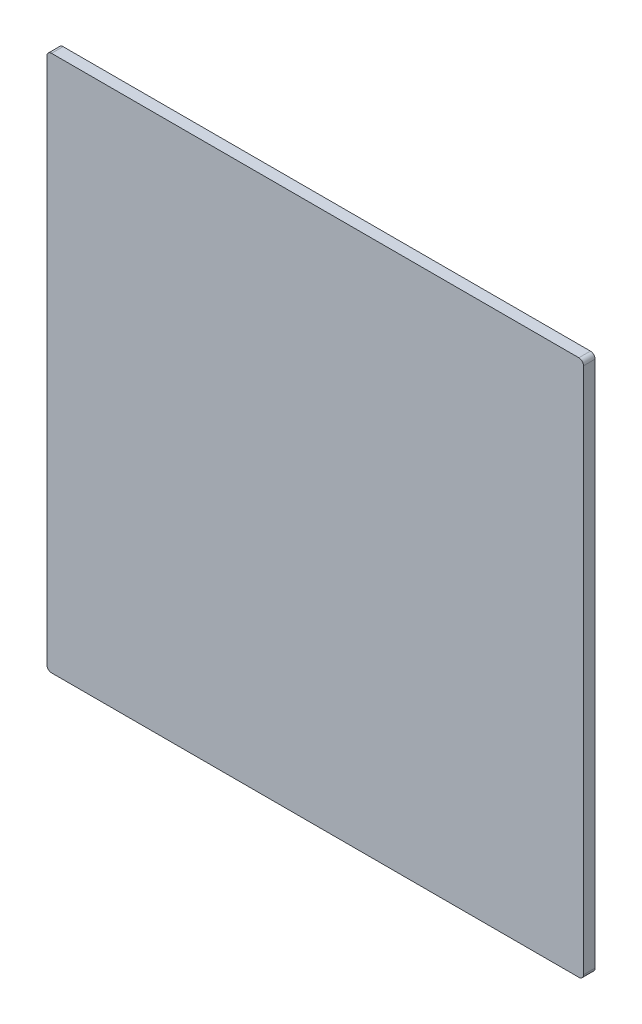
ISO-10303-21;
HEADER;
FILE_DESCRIPTION(('STEP AP214'),'2;1');
FILE_NAME('part.step','',(''),(''),'','','');
FILE_SCHEMA(('AUTOMOTIVE_DESIGN { 1 0 10303 214 1 1 1 1 }'));
ENDSEC;
DATA;
#1=APPLICATION_CONTEXT('core data for automotive mechanical design processes');
#2=APPLICATION_PROTOCOL_DEFINITION('international standard','automotive_design',2000,#1);
#3=PRODUCT_CONTEXT('',#1,'mechanical');
#4=PRODUCT('Part','Part','',(#3));
#5=PRODUCT_RELATED_PRODUCT_CATEGORY('part','',(#4));
#6=PRODUCT_DEFINITION_FORMATION('','',#4);
#7=PRODUCT_DEFINITION_CONTEXT('part definition',#1,'design');
#8=PRODUCT_DEFINITION('design','',#6,#7);
#9=PRODUCT_DEFINITION_SHAPE('','',#8);
#10=(LENGTH_UNIT() NAMED_UNIT(*) SI_UNIT(.MILLI.,.METRE.));
#11=(NAMED_UNIT(*) PLANE_ANGLE_UNIT() SI_UNIT($,.RADIAN.));
#12=(NAMED_UNIT(*) SI_UNIT($,.STERADIAN.) SOLID_ANGLE_UNIT());
#13=UNCERTAINTY_MEASURE_WITH_UNIT(LENGTH_MEASURE(1.E-05),#10,'distance_accuracy_value','');
#14=(GEOMETRIC_REPRESENTATION_CONTEXT(3) GLOBAL_UNCERTAINTY_ASSIGNED_CONTEXT((#13)) GLOBAL_UNIT_ASSIGNED_CONTEXT((#10,
#11,#12)) REPRESENTATION_CONTEXT('',''));
#15=CARTESIAN_POINT('',(0.,0.,0.));
#16=DIRECTION('',(0.,0.,1.));
#17=DIRECTION('',(1.,0.,0.));
#18=AXIS2_PLACEMENT_3D('',#15,#16,#17);
#19=CARTESIAN_POINT('',(0.,0.,6.35));
#20=DIRECTION('',(1.,0.,0.));
#21=DIRECTION('',(0.,1.,0.));
#22=AXIS2_PLACEMENT_3D('',#19,#20,#21);
#23=PLANE('',#22);
#24=DIRECTION('',(0.,-1.,0.));
#25=VECTOR('',#24,1.);
#26=CARTESIAN_POINT('',(0.,0.,0.));
#27=LINE('',#26,#25);
#28=CARTESIAN_POINT('',(0.,292.1,0.));
#29=VERTEX_POINT('',#28);
#30=CARTESIAN_POINT('',(0.,2.54,0.));
#31=VERTEX_POINT('',#30);
#32=EDGE_CURVE('E132',#29,#31,#27,.T.);
#33=ORIENTED_EDGE('',*,*,#32,.T.);
#34=DIRECTION('',(0.,0.,-1.));
#35=VECTOR('',#34,1.);
#36=CARTESIAN_POINT('',(0.,2.54,6.35));
#37=LINE('',#36,#35);
#38=CARTESIAN_POINT('',(0.,2.54,6.35));
#39=VERTEX_POINT('',#38);
#40=EDGE_CURVE('E110',#31,#39,#37,.F.);
#41=ORIENTED_EDGE('',*,*,#40,.T.);
#42=DIRECTION('',(0.,-1.,0.));
#43=VECTOR('',#42,1.);
#44=CARTESIAN_POINT('',(0.,0.,6.35));
#45=LINE('',#44,#43);
#46=CARTESIAN_POINT('',(0.,292.1,6.35));
#47=VERTEX_POINT('',#46);
#48=EDGE_CURVE('E140',#47,#39,#45,.T.);
#49=ORIENTED_EDGE('',*,*,#48,.F.);
#50=DIRECTION('',(0.,0.,-1.));
#51=VECTOR('',#50,1.);
#52=CARTESIAN_POINT('',(0.,292.1,6.35));
#53=LINE('',#52,#51);
#54=EDGE_CURVE('E115',#47,#29,#53,.T.);
#55=ORIENTED_EDGE('',*,*,#54,.T.);
#56=EDGE_LOOP('',(#33,#41,#49,#55));
#57=FACE_BOUND('',#56,.T.);
#58=ADVANCED_FACE('F39',(#57),#23,.F.);
#59=CARTESIAN_POINT('',(0.,0.,6.35));
#60=DIRECTION('',(0.,1.,0.));
#61=DIRECTION('',(0.,0.,1.));
#62=AXIS2_PLACEMENT_3D('',#59,#60,#61);
#63=PLANE('',#62);
#64=DIRECTION('',(1.,0.,0.));
#65=VECTOR('',#64,1.);
#66=CARTESIAN_POINT('',(0.,0.,6.35));
#67=LINE('',#66,#65);
#68=CARTESIAN_POINT('',(2.54,0.,6.35));
#69=VERTEX_POINT('',#68);
#70=CARTESIAN_POINT('',(292.1,0.,6.35));
#71=VERTEX_POINT('',#70);
#72=EDGE_CURVE('E125',#69,#71,#67,.T.);
#73=ORIENTED_EDGE('',*,*,#72,.F.);
#74=DIRECTION('',(0.,0.,-1.));
#75=VECTOR('',#74,1.);
#76=CARTESIAN_POINT('',(2.54,0.,6.35));
#77=LINE('',#76,#75);
#78=CARTESIAN_POINT('',(2.54,0.,0.));
#79=VERTEX_POINT('',#78);
#80=EDGE_CURVE('E109',#69,#79,#77,.T.);
#81=ORIENTED_EDGE('',*,*,#80,.T.);
#82=DIRECTION('',(1.,0.,0.));
#83=VECTOR('',#82,1.);
#84=CARTESIAN_POINT('',(0.,0.,0.));
#85=LINE('',#84,#83);
#86=CARTESIAN_POINT('',(292.1,0.,0.));
#87=VERTEX_POINT('',#86);
#88=EDGE_CURVE('E122',#79,#87,#85,.T.);
#89=ORIENTED_EDGE('',*,*,#88,.T.);
#90=DIRECTION('',(0.,0.,-1.));
#91=VECTOR('',#90,1.);
#92=CARTESIAN_POINT('',(292.1,0.,6.35));
#93=LINE('',#92,#91);
#94=EDGE_CURVE('E127',#87,#71,#93,.F.);
#95=ORIENTED_EDGE('',*,*,#94,.T.);
#96=EDGE_LOOP('',(#73,#81,#89,#95));
#97=FACE_BOUND('',#96,.T.);
#98=ADVANCED_FACE('F121',(#97),#63,.F.);
#99=CARTESIAN_POINT('',(294.64,0.,6.35));
#100=DIRECTION('',(-1.,0.,0.));
#101=DIRECTION('',(0.,-1.,0.));
#102=AXIS2_PLACEMENT_3D('',#99,#100,#101);
#103=PLANE('',#102);
#104=DIRECTION('',(0.,1.,0.));
#105=VECTOR('',#104,1.);
#106=CARTESIAN_POINT('',(294.64,0.,6.35));
#107=LINE('',#106,#105);
#108=CARTESIAN_POINT('',(294.64,2.54,6.35));
#109=VERTEX_POINT('',#108);
#110=CARTESIAN_POINT('',(294.64,292.1,6.35));
#111=VERTEX_POINT('',#110);
#112=EDGE_CURVE('E170',#109,#111,#107,.T.);
#113=ORIENTED_EDGE('',*,*,#112,.F.);
#114=DIRECTION('',(0.,0.,-1.));
#115=VECTOR('',#114,1.);
#116=CARTESIAN_POINT('',(294.64,2.54,6.35));
#117=LINE('',#116,#115);
#118=CARTESIAN_POINT('',(294.64,2.54,0.));
#119=VERTEX_POINT('',#118);
#120=EDGE_CURVE('E163',#109,#119,#117,.T.);
#121=ORIENTED_EDGE('',*,*,#120,.T.);
#122=DIRECTION('',(0.,1.,0.));
#123=VECTOR('',#122,1.);
#124=CARTESIAN_POINT('',(294.64,0.,0.));
#125=LINE('',#124,#123);
#126=CARTESIAN_POINT('',(294.64,292.1,0.));
#127=VERTEX_POINT('',#126);
#128=EDGE_CURVE('E131',#119,#127,#125,.T.);
#129=ORIENTED_EDGE('',*,*,#128,.T.);
#130=DIRECTION('',(0.,0.,-1.));
#131=VECTOR('',#130,1.);
#132=CARTESIAN_POINT('',(294.64,292.1,6.35));
#133=LINE('',#132,#131);
#134=EDGE_CURVE('E161',#127,#111,#133,.F.);
#135=ORIENTED_EDGE('',*,*,#134,.T.);
#136=EDGE_LOOP('',(#113,#121,#129,#135));
#137=FACE_BOUND('',#136,.T.);
#138=ADVANCED_FACE('F168',(#137),#103,.F.);
#139=CARTESIAN_POINT('',(0.,294.64,6.35));
#140=DIRECTION('',(0.,-1.,0.));
#141=DIRECTION('',(0.,0.,-1.));
#142=AXIS2_PLACEMENT_3D('',#139,#140,#141);
#143=PLANE('',#142);
#144=DIRECTION('',(-1.,0.,0.));
#145=VECTOR('',#144,1.);
#146=CARTESIAN_POINT('',(0.,294.64,6.35));
#147=LINE('',#146,#145);
#148=CARTESIAN_POINT('',(292.1,294.64,6.35));
#149=VERTEX_POINT('',#148);
#150=CARTESIAN_POINT('',(2.53999999999995,294.64,6.35));
#151=VERTEX_POINT('',#150);
#152=EDGE_CURVE('E141',#149,#151,#147,.T.);
#153=ORIENTED_EDGE('',*,*,#152,.F.);
#154=DIRECTION('',(0.,0.,-1.));
#155=VECTOR('',#154,1.);
#156=CARTESIAN_POINT('',(292.1,294.64,6.35));
#157=LINE('',#156,#155);
#158=CARTESIAN_POINT('',(292.1,294.64,0.));
#159=VERTEX_POINT('',#158);
#160=EDGE_CURVE('E12',#149,#159,#157,.T.);
#161=ORIENTED_EDGE('',*,*,#160,.T.);
#162=DIRECTION('',(-1.,0.,0.));
#163=VECTOR('',#162,1.);
#164=CARTESIAN_POINT('',(0.,294.64,0.));
#165=LINE('',#164,#163);
#166=CARTESIAN_POINT('',(2.53999999999995,294.64,0.));
#167=VERTEX_POINT('',#166);
#168=EDGE_CURVE('E135',#159,#167,#165,.T.);
#169=ORIENTED_EDGE('',*,*,#168,.T.);
#170=DIRECTION('',(0.,0.,-1.));
#171=VECTOR('',#170,1.);
#172=CARTESIAN_POINT('',(2.53999999999995,294.64,6.35));
#173=LINE('',#172,#171);
#174=EDGE_CURVE('E47',#167,#151,#173,.F.);
#175=ORIENTED_EDGE('',*,*,#174,.T.);
#176=EDGE_LOOP('',(#153,#161,#169,#175));
#177=FACE_BOUND('',#176,.T.);
#178=ADVANCED_FACE('F177',(#177),#143,.F.);
#179=CARTESIAN_POINT('',(0.,0.,6.35));
#180=DIRECTION('',(0.,0.,-1.));
#181=DIRECTION('',(-1.,0.,0.));
#182=AXIS2_PLACEMENT_3D('',#179,#180,#181);
#183=PLANE('',#182);
#184=ORIENTED_EDGE('',*,*,#48,.T.);
#185=CARTESIAN_POINT('',(2.54,2.54,6.35));
#186=DIRECTION('',(0.,0.,-1.));
#187=DIRECTION('',(-1.,0.,0.));
#188=AXIS2_PLACEMENT_3D('',#185,#186,#187);
#189=CIRCLE('',#188,2.54);
#190=EDGE_CURVE('E158',#39,#69,#189,.F.);
#191=ORIENTED_EDGE('',*,*,#190,.T.);
#192=ORIENTED_EDGE('',*,*,#72,.T.);
#193=CARTESIAN_POINT('',(292.1,2.54,6.35));
#194=DIRECTION('',(0.,0.,-1.));
#195=DIRECTION('',(-1.,0.,0.));
#196=AXIS2_PLACEMENT_3D('',#193,#194,#195);
#197=CIRCLE('',#196,2.54);
#198=EDGE_CURVE('E155',#71,#109,#197,.F.);
#199=ORIENTED_EDGE('',*,*,#198,.T.);
#200=ORIENTED_EDGE('',*,*,#112,.T.);
#201=CARTESIAN_POINT('',(292.1,292.1,6.35));
#202=DIRECTION('',(0.,0.,-1.));
#203=DIRECTION('',(-1.,0.,0.));
#204=AXIS2_PLACEMENT_3D('',#201,#202,#203);
#205=CIRCLE('',#204,2.54);
#206=EDGE_CURVE('E60',#111,#149,#205,.F.);
#207=ORIENTED_EDGE('',*,*,#206,.T.);
#208=ORIENTED_EDGE('',*,*,#152,.T.);
#209=CARTESIAN_POINT('',(2.53999999999995,292.1,6.35));
#210=DIRECTION('',(0.,0.,-1.));
#211=DIRECTION('',(-1.,0.,0.));
#212=AXIS2_PLACEMENT_3D('',#209,#210,#211);
#213=CIRCLE('',#212,2.54);
#214=EDGE_CURVE('E150',#151,#47,#213,.F.);
#215=ORIENTED_EDGE('',*,*,#214,.T.);
#216=EDGE_LOOP('',(#184,#191,#192,#199,#200,#207,#208,#215));
#217=FACE_BOUND('',#216,.T.);
#218=ADVANCED_FACE('F194',(#217),#183,.F.);
#219=CARTESIAN_POINT('',(0.,0.,0.));
#220=DIRECTION('',(0.,0.,-1.));
#221=DIRECTION('',(-1.,0.,0.));
#222=AXIS2_PLACEMENT_3D('',#219,#220,#221);
#223=PLANE('',#222);
#224=ORIENTED_EDGE('',*,*,#88,.F.);
#225=CARTESIAN_POINT('',(2.54,2.54,0.));
#226=DIRECTION('',(0.,0.,-1.));
#227=DIRECTION('',(-1.,0.,0.));
#228=AXIS2_PLACEMENT_3D('',#225,#226,#227);
#229=CIRCLE('',#228,2.54);
#230=EDGE_CURVE('E105',#79,#31,#229,.T.);
#231=ORIENTED_EDGE('',*,*,#230,.T.);
#232=ORIENTED_EDGE('',*,*,#32,.F.);
#233=CARTESIAN_POINT('',(2.53999999999995,292.1,0.));
#234=DIRECTION('',(0.,0.,-1.));
#235=DIRECTION('',(-1.,0.,0.));
#236=AXIS2_PLACEMENT_3D('',#233,#234,#235);
#237=CIRCLE('',#236,2.54);
#238=EDGE_CURVE('E126',#29,#167,#237,.T.);
#239=ORIENTED_EDGE('',*,*,#238,.T.);
#240=ORIENTED_EDGE('',*,*,#168,.F.);
#241=CARTESIAN_POINT('',(292.1,292.1,0.));
#242=DIRECTION('',(0.,0.,-1.));
#243=DIRECTION('',(-1.,0.,0.));
#244=AXIS2_PLACEMENT_3D('',#241,#242,#243);
#245=CIRCLE('',#244,2.54);
#246=EDGE_CURVE('E144',#159,#127,#245,.T.);
#247=ORIENTED_EDGE('',*,*,#246,.T.);
#248=ORIENTED_EDGE('',*,*,#128,.F.);
#249=CARTESIAN_POINT('',(292.1,2.54,0.));
#250=DIRECTION('',(0.,0.,-1.));
#251=DIRECTION('',(-1.,0.,0.));
#252=AXIS2_PLACEMENT_3D('',#249,#250,#251);
#253=CIRCLE('',#252,2.54);
#254=EDGE_CURVE('E116',#119,#87,#253,.T.);
#255=ORIENTED_EDGE('',*,*,#254,.T.);
#256=EDGE_LOOP('',(#224,#231,#232,#239,#240,#247,#248,#255));
#257=FACE_BOUND('',#256,.T.);
#258=ADVANCED_FACE('F129',(#257),#223,.T.);
#259=CARTESIAN_POINT('',(2.54,2.54,6.35));
#260=DIRECTION('',(0.,0.,-1.));
#261=DIRECTION('',(-1.,0.,0.));
#262=AXIS2_PLACEMENT_3D('',#259,#260,#261);
#263=CYLINDRICAL_SURFACE('',#262,2.54);
#264=ORIENTED_EDGE('',*,*,#190,.F.);
#265=ORIENTED_EDGE('',*,*,#40,.F.);
#266=ORIENTED_EDGE('',*,*,#230,.F.);
#267=ORIENTED_EDGE('',*,*,#80,.F.);
#268=EDGE_LOOP('',(#264,#265,#266,#267));
#269=FACE_BOUND('',#268,.T.);
#270=ADVANCED_FACE('F108',(#269),#263,.T.);
#271=CARTESIAN_POINT('',(292.1,2.54,6.35));
#272=DIRECTION('',(0.,0.,-1.));
#273=DIRECTION('',(-1.,0.,0.));
#274=AXIS2_PLACEMENT_3D('',#271,#272,#273);
#275=CYLINDRICAL_SURFACE('',#274,2.54);
#276=ORIENTED_EDGE('',*,*,#198,.F.);
#277=ORIENTED_EDGE('',*,*,#94,.F.);
#278=ORIENTED_EDGE('',*,*,#254,.F.);
#279=ORIENTED_EDGE('',*,*,#120,.F.);
#280=EDGE_LOOP('',(#276,#277,#278,#279));
#281=FACE_BOUND('',#280,.T.);
#282=ADVANCED_FACE('F195',(#281),#275,.T.);
#283=CARTESIAN_POINT('',(292.1,292.1,6.35));
#284=DIRECTION('',(0.,0.,-1.));
#285=DIRECTION('',(-1.,0.,0.));
#286=AXIS2_PLACEMENT_3D('',#283,#284,#285);
#287=CYLINDRICAL_SURFACE('',#286,2.54);
#288=ORIENTED_EDGE('',*,*,#206,.F.);
#289=ORIENTED_EDGE('',*,*,#134,.F.);
#290=ORIENTED_EDGE('',*,*,#246,.F.);
#291=ORIENTED_EDGE('',*,*,#160,.F.);
#292=EDGE_LOOP('',(#288,#289,#290,#291));
#293=FACE_BOUND('',#292,.T.);
#294=ADVANCED_FACE('F176',(#293),#287,.T.);
#295=CARTESIAN_POINT('',(2.53999999999995,292.1,6.35));
#296=DIRECTION('',(0.,0.,-1.));
#297=DIRECTION('',(-1.,0.,0.));
#298=AXIS2_PLACEMENT_3D('',#295,#296,#297);
#299=CYLINDRICAL_SURFACE('',#298,2.54);
#300=ORIENTED_EDGE('',*,*,#214,.F.);
#301=ORIENTED_EDGE('',*,*,#174,.F.);
#302=ORIENTED_EDGE('',*,*,#238,.F.);
#303=ORIENTED_EDGE('',*,*,#54,.F.);
#304=EDGE_LOOP('',(#300,#301,#302,#303));
#305=FACE_BOUND('',#304,.T.);
#306=ADVANCED_FACE('F41',(#305),#299,.T.);
#307=CLOSED_SHELL('',(#58,#98,#138,#178,#218,#258,#270,#282,#294,#306));
#308=MANIFOLD_SOLID_BREP('B2',#307);
#309=ADVANCED_BREP_SHAPE_REPRESENTATION('',(#18,#308),#14);
#310=SHAPE_DEFINITION_REPRESENTATION(#9,#309);
ENDSEC;
END-ISO-10303-21;
